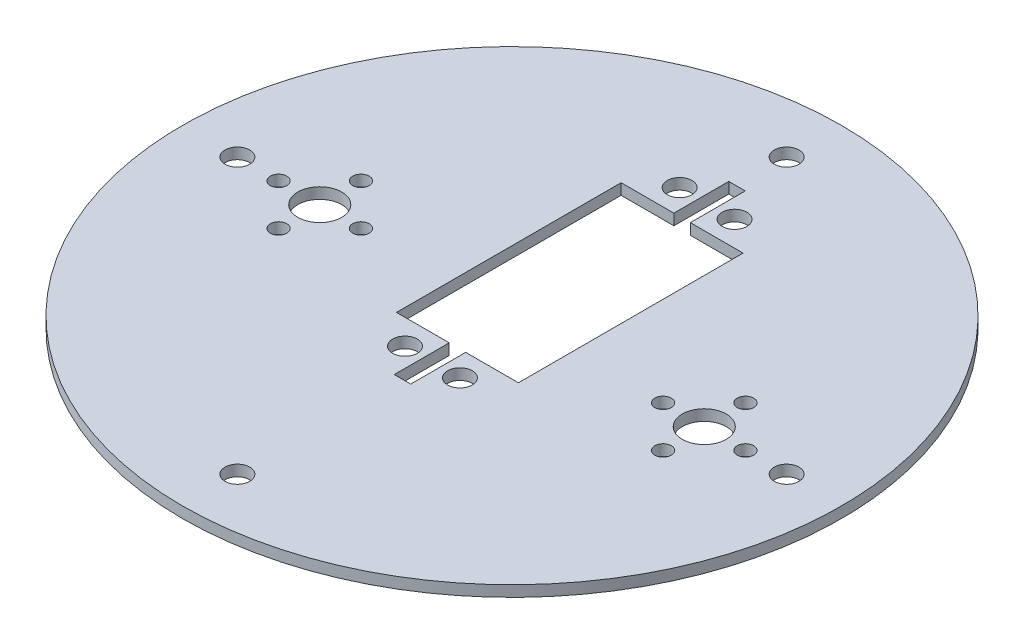
ISO-10303-21;
HEADER;
FILE_DESCRIPTION(('STEP AP214'),'2;1');
FILE_NAME('part.step','',(''),(''),'','','');
FILE_SCHEMA(('AUTOMOTIVE_DESIGN { 1 0 10303 214 1 1 1 1 }'));
ENDSEC;
DATA;
#1=APPLICATION_CONTEXT('core data for automotive mechanical design processes');
#2=APPLICATION_PROTOCOL_DEFINITION('international standard','automotive_design',2000,#1);
#3=PRODUCT_CONTEXT('',#1,'mechanical');
#4=PRODUCT('Part','Part','',(#3));
#5=PRODUCT_RELATED_PRODUCT_CATEGORY('part','',(#4));
#6=PRODUCT_DEFINITION_FORMATION('','',#4);
#7=PRODUCT_DEFINITION_CONTEXT('part definition',#1,'design');
#8=PRODUCT_DEFINITION('design','',#6,#7);
#9=PRODUCT_DEFINITION_SHAPE('','',#8);
#10=(LENGTH_UNIT() NAMED_UNIT(*) SI_UNIT(.MILLI.,.METRE.));
#11=(NAMED_UNIT(*) PLANE_ANGLE_UNIT() SI_UNIT($,.RADIAN.));
#12=(NAMED_UNIT(*) SI_UNIT($,.STERADIAN.) SOLID_ANGLE_UNIT());
#13=UNCERTAINTY_MEASURE_WITH_UNIT(LENGTH_MEASURE(1.E-05),#10,'distance_accuracy_value','');
#14=(GEOMETRIC_REPRESENTATION_CONTEXT(3) GLOBAL_UNCERTAINTY_ASSIGNED_CONTEXT((#13)) GLOBAL_UNIT_ASSIGNED_CONTEXT((#10,
#11,#12)) REPRESENTATION_CONTEXT('',''));
#15=CARTESIAN_POINT('',(0.,0.,0.));
#16=DIRECTION('',(0.,0.,1.));
#17=DIRECTION('',(1.,0.,0.));
#18=AXIS2_PLACEMENT_3D('',#15,#16,#17);
#19=CARTESIAN_POINT('',(0.,2.,-30.9));
#20=DIRECTION('',(0.,0.,-1.));
#21=DIRECTION('',(-1.,0.,0.));
#22=AXIS2_PLACEMENT_3D('',#19,#20,#21);
#23=PLANE('',#22);
#24=DIRECTION('',(0.,-1.,0.));
#25=VECTOR('',#24,1.);
#26=CARTESIAN_POINT('',(1.56757903743948,2.,-30.9));
#27=LINE('',#26,#25);
#28=CARTESIAN_POINT('',(1.56757903743948,2.,-30.9));
#29=VERTEX_POINT('',#28);
#30=CARTESIAN_POINT('',(1.56757903743948,0.,-30.9));
#31=VERTEX_POINT('',#30);
#32=EDGE_CURVE('E156',#29,#31,#27,.T.);
#33=ORIENTED_EDGE('',*,*,#32,.T.);
#34=DIRECTION('',(1.,0.,0.));
#35=VECTOR('',#34,1.);
#36=CARTESIAN_POINT('',(0.,0.,-30.9));
#37=LINE('',#36,#35);
#38=CARTESIAN_POINT('',(11.1675790374395,0.,-30.9));
#39=VERTEX_POINT('',#38);
#40=EDGE_CURVE('E317',#31,#39,#37,.T.);
#41=ORIENTED_EDGE('',*,*,#40,.T.);
#42=DIRECTION('',(0.,-1.,0.));
#43=VECTOR('',#42,1.);
#44=CARTESIAN_POINT('',(11.1675790374395,2.,-30.9));
#45=LINE('',#44,#43);
#46=CARTESIAN_POINT('',(11.1675790374395,2.,-30.9));
#47=VERTEX_POINT('',#46);
#48=EDGE_CURVE('E253',#47,#39,#45,.T.);
#49=ORIENTED_EDGE('',*,*,#48,.F.);
#50=DIRECTION('',(1.,0.,0.));
#51=VECTOR('',#50,1.);
#52=CARTESIAN_POINT('',(0.,2.,-30.9));
#53=LINE('',#52,#51);
#54=EDGE_CURVE('E248',#29,#47,#53,.T.);
#55=ORIENTED_EDGE('',*,*,#54,.F.);
#56=EDGE_LOOP('',(#33,#41,#49,#55));
#57=FACE_BOUND('',#56,.T.);
#58=ADVANCED_FACE('F34',(#57),#23,.F.);
#59=CARTESIAN_POINT('',(0.,2.,10.));
#60=DIRECTION('',(0.,0.,-1.));
#61=DIRECTION('',(-1.,0.,0.));
#62=AXIS2_PLACEMENT_3D('',#59,#60,#61);
#63=PLANE('',#62);
#64=DIRECTION('',(1.,0.,0.));
#65=VECTOR('',#64,1.);
#66=CARTESIAN_POINT('',(0.,2.,10.));
#67=LINE('',#66,#65);
#68=CARTESIAN_POINT('',(-11.0324209625605,2.,10.));
#69=VERTEX_POINT('',#68);
#70=CARTESIAN_POINT('',(-1.43242096256052,2.,10.));
#71=VERTEX_POINT('',#70);
#72=EDGE_CURVE('E243',#69,#71,#67,.T.);
#73=ORIENTED_EDGE('',*,*,#72,.T.);
#74=DIRECTION('',(0.,-1.,0.));
#75=VECTOR('',#74,1.);
#76=CARTESIAN_POINT('',(-1.43242096256052,2.,10.));
#77=LINE('',#76,#75);
#78=CARTESIAN_POINT('',(-1.43242096256052,0.,10.));
#79=VERTEX_POINT('',#78);
#80=EDGE_CURVE('E178',#71,#79,#77,.T.);
#81=ORIENTED_EDGE('',*,*,#80,.T.);
#82=DIRECTION('',(1.,0.,0.));
#83=VECTOR('',#82,1.);
#84=CARTESIAN_POINT('',(0.,0.,10.));
#85=LINE('',#84,#83);
#86=CARTESIAN_POINT('',(-11.0324209625605,0.,10.));
#87=VERTEX_POINT('',#86);
#88=EDGE_CURVE('E311',#87,#79,#85,.T.);
#89=ORIENTED_EDGE('',*,*,#88,.F.);
#90=DIRECTION('',(0.,-1.,0.));
#91=VECTOR('',#90,1.);
#92=CARTESIAN_POINT('',(-11.0324209625605,2.,10.));
#93=LINE('',#92,#91);
#94=EDGE_CURVE('E42',#69,#87,#93,.T.);
#95=ORIENTED_EDGE('',*,*,#94,.F.);
#96=EDGE_LOOP('',(#73,#81,#89,#95));
#97=FACE_BOUND('',#96,.T.);
#98=ADVANCED_FACE('F338',(#97),#63,.T.);
#99=CARTESIAN_POINT('',(11.1675790374395,2.,0.));
#100=DIRECTION('',(-1.,0.,0.));
#101=DIRECTION('',(0.,0.,1.));
#102=AXIS2_PLACEMENT_3D('',#99,#100,#101);
#103=PLANE('',#102);
#104=DIRECTION('',(0.,0.,-1.));
#105=VECTOR('',#104,1.);
#106=CARTESIAN_POINT('',(11.1675790374395,0.,0.));
#107=LINE('',#106,#105);
#108=CARTESIAN_POINT('',(11.1675790374395,0.,10.));
#109=VERTEX_POINT('',#108);
#110=EDGE_CURVE('E307',#109,#39,#107,.T.);
#111=ORIENTED_EDGE('',*,*,#110,.F.);
#112=DIRECTION('',(0.,-1.,0.));
#113=VECTOR('',#112,1.);
#114=CARTESIAN_POINT('',(11.1675790374395,2.,10.));
#115=LINE('',#114,#113);
#116=CARTESIAN_POINT('',(11.1675790374395,2.,10.));
#117=VERTEX_POINT('',#116);
#118=EDGE_CURVE('E11',#117,#109,#115,.T.);
#119=ORIENTED_EDGE('',*,*,#118,.F.);
#120=DIRECTION('',(0.,0.,-1.));
#121=VECTOR('',#120,1.);
#122=CARTESIAN_POINT('',(11.1675790374395,2.,0.));
#123=LINE('',#122,#121);
#124=EDGE_CURVE('E239',#117,#47,#123,.T.);
#125=ORIENTED_EDGE('',*,*,#124,.T.);
#126=ORIENTED_EDGE('',*,*,#48,.T.);
#127=EDGE_LOOP('',(#111,#119,#125,#126));
#128=FACE_BOUND('',#127,.T.);
#129=ADVANCED_FACE('F359',(#128),#103,.T.);
#130=DIRECTION('',(0.,-1.,0.));
#131=VECTOR('',#130,1.);
#132=CARTESIAN_POINT('',(1.56757903743948,2.,10.));
#133=LINE('',#132,#131);
#134=CARTESIAN_POINT('',(1.56757903743948,2.,10.));
#135=VERTEX_POINT('',#134);
#136=CARTESIAN_POINT('',(1.56757903743948,0.,10.));
#137=VERTEX_POINT('',#136);
#138=EDGE_CURVE('E175',#135,#137,#133,.T.);
#139=ORIENTED_EDGE('',*,*,#138,.F.);
#140=EDGE_CURVE('E242',#135,#117,#67,.T.);
#141=ORIENTED_EDGE('',*,*,#140,.T.);
#142=ORIENTED_EDGE('',*,*,#118,.T.);
#143=EDGE_CURVE('E310',#137,#109,#85,.T.);
#144=ORIENTED_EDGE('',*,*,#143,.F.);
#145=EDGE_LOOP('',(#139,#141,#142,#144));
#146=FACE_BOUND('',#145,.T.);
#147=ADVANCED_FACE('F352',(#146),#63,.T.);
#148=CARTESIAN_POINT('',(-11.0324209625605,2.,0.));
#149=DIRECTION('',(-1.,0.,0.));
#150=DIRECTION('',(0.,0.,1.));
#151=AXIS2_PLACEMENT_3D('',#148,#149,#150);
#152=PLANE('',#151);
#153=DIRECTION('',(0.,0.,-1.));
#154=VECTOR('',#153,1.);
#155=CARTESIAN_POINT('',(-11.0324209625605,0.,0.));
#156=LINE('',#155,#154);
#157=CARTESIAN_POINT('',(-11.0324209625605,0.,-30.9));
#158=VERTEX_POINT('',#157);
#159=EDGE_CURVE('E314',#87,#158,#156,.T.);
#160=ORIENTED_EDGE('',*,*,#159,.T.);
#161=DIRECTION('',(0.,-1.,0.));
#162=VECTOR('',#161,1.);
#163=CARTESIAN_POINT('',(-11.0324209625605,2.,-30.9));
#164=LINE('',#163,#162);
#165=CARTESIAN_POINT('',(-11.0324209625605,2.,-30.9));
#166=VERTEX_POINT('',#165);
#167=EDGE_CURVE('E325',#166,#158,#164,.T.);
#168=ORIENTED_EDGE('',*,*,#167,.F.);
#169=DIRECTION('',(0.,0.,-1.));
#170=VECTOR('',#169,1.);
#171=CARTESIAN_POINT('',(-11.0324209625605,2.,0.));
#172=LINE('',#171,#170);
#173=EDGE_CURVE('E246',#69,#166,#172,.T.);
#174=ORIENTED_EDGE('',*,*,#173,.F.);
#175=ORIENTED_EDGE('',*,*,#94,.T.);
#176=EDGE_LOOP('',(#160,#168,#174,#175));
#177=FACE_BOUND('',#176,.T.);
#178=ADVANCED_FACE('F330',(#177),#152,.F.);
#179=CARTESIAN_POINT('',(-1.43242096256052,0.,-30.9));
#180=VERTEX_POINT('',#179);
#181=EDGE_CURVE('E318',#158,#180,#37,.T.);
#182=ORIENTED_EDGE('',*,*,#181,.T.);
#183=DIRECTION('',(0.,-1.,0.));
#184=VECTOR('',#183,1.);
#185=CARTESIAN_POINT('',(-1.43242096256052,2.,-30.9));
#186=LINE('',#185,#184);
#187=CARTESIAN_POINT('',(-1.43242096256052,2.,-30.9));
#188=VERTEX_POINT('',#187);
#189=EDGE_CURVE('E154',#188,#180,#186,.T.);
#190=ORIENTED_EDGE('',*,*,#189,.F.);
#191=EDGE_CURVE('E144',#166,#188,#53,.T.);
#192=ORIENTED_EDGE('',*,*,#191,.F.);
#193=ORIENTED_EDGE('',*,*,#167,.T.);
#194=EDGE_LOOP('',(#182,#190,#192,#193));
#195=FACE_BOUND('',#194,.T.);
#196=ADVANCED_FACE('F365',(#195),#23,.F.);
#197=CARTESIAN_POINT('',(0.,2.,-50.));
#198=DIRECTION('',(0.,-1.,0.));
#199=DIRECTION('',(0.,0.,-1.));
#200=AXIS2_PLACEMENT_3D('',#197,#198,#199);
#201=CYLINDRICAL_SURFACE('',#200,2.25);
#202=CARTESIAN_POINT('',(0.,2.,-50.));
#203=DIRECTION('',(0.,1.,0.));
#204=DIRECTION('',(0.,0.,1.));
#205=AXIS2_PLACEMENT_3D('',#202,#203,#204);
#206=CIRCLE('',#205,2.25);
#207=CARTESIAN_POINT('',(0.,2.,-47.75));
#208=VERTEX_POINT('',#207);
#209=EDGE_CURVE('E236',#208,#208,#206,.T.);
#210=ORIENTED_EDGE('',*,*,#209,.T.);
#211=EDGE_LOOP('',(#210));
#212=FACE_BOUND('',#211,.T.);
#213=CARTESIAN_POINT('',(0.,0.,-50.));
#214=DIRECTION('',(0.,1.,0.));
#215=DIRECTION('',(0.,0.,1.));
#216=AXIS2_PLACEMENT_3D('',#213,#214,#215);
#217=CIRCLE('',#216,2.25);
#218=CARTESIAN_POINT('',(0.,0.,-47.75));
#219=VERTEX_POINT('',#218);
#220=EDGE_CURVE('E304',#219,#219,#217,.T.);
#221=ORIENTED_EDGE('',*,*,#220,.F.);
#222=EDGE_LOOP('',(#221));
#223=FACE_BOUND('',#222,.T.);
#224=ADVANCED_FACE('F367',(#212,#223),#201,.F.);
#225=CARTESIAN_POINT('',(50.,2.,0.));
#226=DIRECTION('',(0.,-1.,0.));
#227=DIRECTION('',(0.,0.,-1.));
#228=AXIS2_PLACEMENT_3D('',#225,#226,#227);
#229=CYLINDRICAL_SURFACE('',#228,2.25000000000017);
#230=CARTESIAN_POINT('',(50.,2.,0.));
#231=DIRECTION('',(0.,1.,0.));
#232=DIRECTION('',(0.,0.,1.));
#233=AXIS2_PLACEMENT_3D('',#230,#231,#232);
#234=CIRCLE('',#233,2.25000000000017);
#235=CARTESIAN_POINT('',(50.,2.,2.25000000000017));
#236=VERTEX_POINT('',#235);
#237=EDGE_CURVE('E233',#236,#236,#234,.T.);
#238=ORIENTED_EDGE('',*,*,#237,.T.);
#239=EDGE_LOOP('',(#238));
#240=FACE_BOUND('',#239,.T.);
#241=CARTESIAN_POINT('',(50.,0.,0.));
#242=DIRECTION('',(0.,1.,0.));
#243=DIRECTION('',(0.,0.,1.));
#244=AXIS2_PLACEMENT_3D('',#241,#242,#243);
#245=CIRCLE('',#244,2.25000000000017);
#246=CARTESIAN_POINT('',(50.,0.,2.25000000000017));
#247=VERTEX_POINT('',#246);
#248=EDGE_CURVE('E301',#247,#247,#245,.T.);
#249=ORIENTED_EDGE('',*,*,#248,.F.);
#250=EDGE_LOOP('',(#249));
#251=FACE_BOUND('',#250,.T.);
#252=ADVANCED_FACE('F373',(#240,#251),#229,.F.);
#253=CARTESIAN_POINT('',(0.,2.,50.));
#254=DIRECTION('',(0.,-1.,0.));
#255=DIRECTION('',(0.,0.,-1.));
#256=AXIS2_PLACEMENT_3D('',#253,#254,#255);
#257=CYLINDRICAL_SURFACE('',#256,2.25000000000035);
#258=CARTESIAN_POINT('',(0.,2.,50.));
#259=DIRECTION('',(0.,1.,0.));
#260=DIRECTION('',(0.,0.,1.));
#261=AXIS2_PLACEMENT_3D('',#258,#259,#260);
#262=CIRCLE('',#261,2.25000000000035);
#263=CARTESIAN_POINT('',(0.,2.,52.2500000000004));
#264=VERTEX_POINT('',#263);
#265=EDGE_CURVE('E230',#264,#264,#262,.T.);
#266=ORIENTED_EDGE('',*,*,#265,.T.);
#267=EDGE_LOOP('',(#266));
#268=FACE_BOUND('',#267,.T.);
#269=CARTESIAN_POINT('',(0.,0.,50.));
#270=DIRECTION('',(0.,1.,0.));
#271=DIRECTION('',(0.,0.,1.));
#272=AXIS2_PLACEMENT_3D('',#269,#270,#271);
#273=CIRCLE('',#272,2.25000000000035);
#274=CARTESIAN_POINT('',(0.,0.,52.2500000000004));
#275=VERTEX_POINT('',#274);
#276=EDGE_CURVE('E298',#275,#275,#273,.T.);
#277=ORIENTED_EDGE('',*,*,#276,.F.);
#278=EDGE_LOOP('',(#277));
#279=FACE_BOUND('',#278,.T.);
#280=ADVANCED_FACE('F415',(#268,#279),#257,.F.);
#281=CARTESIAN_POINT('',(-50.,2.,0.));
#282=DIRECTION('',(0.,-1.,0.));
#283=DIRECTION('',(0.,0.,-1.));
#284=AXIS2_PLACEMENT_3D('',#281,#282,#283);
#285=CYLINDRICAL_SURFACE('',#284,2.25000000000052);
#286=CARTESIAN_POINT('',(-50.,2.,0.));
#287=DIRECTION('',(0.,1.,0.));
#288=DIRECTION('',(0.,0.,1.));
#289=AXIS2_PLACEMENT_3D('',#286,#287,#288);
#290=CIRCLE('',#289,2.25000000000052);
#291=CARTESIAN_POINT('',(-50.,2.,2.25000000000053));
#292=VERTEX_POINT('',#291);
#293=EDGE_CURVE('E227',#292,#292,#290,.T.);
#294=ORIENTED_EDGE('',*,*,#293,.T.);
#295=EDGE_LOOP('',(#294));
#296=FACE_BOUND('',#295,.T.);
#297=CARTESIAN_POINT('',(-50.,0.,0.));
#298=DIRECTION('',(0.,1.,0.));
#299=DIRECTION('',(0.,0.,1.));
#300=AXIS2_PLACEMENT_3D('',#297,#298,#299);
#301=CIRCLE('',#300,2.25000000000052);
#302=CARTESIAN_POINT('',(-50.,0.,2.25000000000053));
#303=VERTEX_POINT('',#302);
#304=EDGE_CURVE('E295',#303,#303,#301,.T.);
#305=ORIENTED_EDGE('',*,*,#304,.F.);
#306=EDGE_LOOP('',(#305));
#307=FACE_BOUND('',#306,.T.);
#308=ADVANCED_FACE('F425',(#296,#307),#285,.F.);
#309=CARTESIAN_POINT('',(-4.93242096256052,2.,-35.45));
#310=DIRECTION('',(0.,-1.,0.));
#311=DIRECTION('',(0.,0.,-1.));
#312=AXIS2_PLACEMENT_3D('',#309,#310,#311);
#313=CYLINDRICAL_SURFACE('',#312,2.25);
#314=CARTESIAN_POINT('',(-4.93242096256052,2.,-35.45));
#315=DIRECTION('',(0.,1.,0.));
#316=DIRECTION('',(0.,0.,1.));
#317=AXIS2_PLACEMENT_3D('',#314,#315,#316);
#318=CIRCLE('',#317,2.25);
#319=CARTESIAN_POINT('',(-4.93242096256052,2.,-33.2));
#320=VERTEX_POINT('',#319);
#321=EDGE_CURVE('E224',#320,#320,#318,.T.);
#322=ORIENTED_EDGE('',*,*,#321,.T.);
#323=EDGE_LOOP('',(#322));
#324=FACE_BOUND('',#323,.T.);
#325=CARTESIAN_POINT('',(-4.93242096256052,0.,-35.45));
#326=DIRECTION('',(0.,1.,0.));
#327=DIRECTION('',(0.,0.,1.));
#328=AXIS2_PLACEMENT_3D('',#325,#326,#327);
#329=CIRCLE('',#328,2.25);
#330=CARTESIAN_POINT('',(-4.93242096256052,0.,-33.2));
#331=VERTEX_POINT('',#330);
#332=EDGE_CURVE('E292',#331,#331,#329,.T.);
#333=ORIENTED_EDGE('',*,*,#332,.F.);
#334=EDGE_LOOP('',(#333));
#335=FACE_BOUND('',#334,.T.);
#336=ADVANCED_FACE('F435',(#324,#335),#313,.F.);
#337=CARTESIAN_POINT('',(5.06757903743948,2.,-35.45));
#338=DIRECTION('',(0.,-1.,0.));
#339=DIRECTION('',(0.,0.,-1.));
#340=AXIS2_PLACEMENT_3D('',#337,#338,#339);
#341=CYLINDRICAL_SURFACE('',#340,2.25);
#342=CARTESIAN_POINT('',(5.06757903743948,2.,-35.45));
#343=DIRECTION('',(0.,1.,0.));
#344=DIRECTION('',(0.,0.,1.));
#345=AXIS2_PLACEMENT_3D('',#342,#343,#344);
#346=CIRCLE('',#345,2.25);
#347=CARTESIAN_POINT('',(5.06757903743948,2.,-33.2));
#348=VERTEX_POINT('',#347);
#349=EDGE_CURVE('E221',#348,#348,#346,.T.);
#350=ORIENTED_EDGE('',*,*,#349,.T.);
#351=EDGE_LOOP('',(#350));
#352=FACE_BOUND('',#351,.T.);
#353=CARTESIAN_POINT('',(5.06757903743948,0.,-35.45));
#354=DIRECTION('',(0.,1.,0.));
#355=DIRECTION('',(0.,0.,1.));
#356=AXIS2_PLACEMENT_3D('',#353,#354,#355);
#357=CIRCLE('',#356,2.25);
#358=CARTESIAN_POINT('',(5.06757903743948,0.,-33.2));
#359=VERTEX_POINT('',#358);
#360=EDGE_CURVE('E289',#359,#359,#357,.T.);
#361=ORIENTED_EDGE('',*,*,#360,.F.);
#362=EDGE_LOOP('',(#361));
#363=FACE_BOUND('',#362,.T.);
#364=ADVANCED_FACE('F445',(#352,#363),#341,.F.);
#365=CARTESIAN_POINT('',(5.06757903744,2.,14.55));
#366=DIRECTION('',(0.,-1.,0.));
#367=DIRECTION('',(0.,0.,-1.));
#368=AXIS2_PLACEMENT_3D('',#365,#366,#367);
#369=CYLINDRICAL_SURFACE('',#368,2.25);
#370=CARTESIAN_POINT('',(5.06757903744,2.,14.55));
#371=DIRECTION('',(0.,1.,0.));
#372=DIRECTION('',(0.,0.,1.));
#373=AXIS2_PLACEMENT_3D('',#370,#371,#372);
#374=CIRCLE('',#373,2.25);
#375=CARTESIAN_POINT('',(5.06757903744,2.,16.8));
#376=VERTEX_POINT('',#375);
#377=EDGE_CURVE('E218',#376,#376,#374,.T.);
#378=ORIENTED_EDGE('',*,*,#377,.T.);
#379=EDGE_LOOP('',(#378));
#380=FACE_BOUND('',#379,.T.);
#381=CARTESIAN_POINT('',(5.06757903744,0.,14.55));
#382=DIRECTION('',(0.,1.,0.));
#383=DIRECTION('',(0.,0.,1.));
#384=AXIS2_PLACEMENT_3D('',#381,#382,#383);
#385=CIRCLE('',#384,2.25);
#386=CARTESIAN_POINT('',(5.06757903744,0.,16.8));
#387=VERTEX_POINT('',#386);
#388=EDGE_CURVE('E286',#387,#387,#385,.T.);
#389=ORIENTED_EDGE('',*,*,#388,.F.);
#390=EDGE_LOOP('',(#389));
#391=FACE_BOUND('',#390,.T.);
#392=ADVANCED_FACE('F455',(#380,#391),#369,.F.);
#393=CARTESIAN_POINT('',(-4.93242096256,2.,14.55));
#394=DIRECTION('',(0.,-1.,0.));
#395=DIRECTION('',(0.,0.,-1.));
#396=AXIS2_PLACEMENT_3D('',#393,#394,#395);
#397=CYLINDRICAL_SURFACE('',#396,2.25);
#398=CARTESIAN_POINT('',(-4.93242096256,2.,14.55));
#399=DIRECTION('',(0.,1.,0.));
#400=DIRECTION('',(0.,0.,1.));
#401=AXIS2_PLACEMENT_3D('',#398,#399,#400);
#402=CIRCLE('',#401,2.25);
#403=CARTESIAN_POINT('',(-4.93242096256,2.,16.8));
#404=VERTEX_POINT('',#403);
#405=EDGE_CURVE('E215',#404,#404,#402,.T.);
#406=ORIENTED_EDGE('',*,*,#405,.T.);
#407=EDGE_LOOP('',(#406));
#408=FACE_BOUND('',#407,.T.);
#409=CARTESIAN_POINT('',(-4.93242096256,0.,14.55));
#410=DIRECTION('',(0.,1.,0.));
#411=DIRECTION('',(0.,0.,1.));
#412=AXIS2_PLACEMENT_3D('',#409,#410,#411);
#413=CIRCLE('',#412,2.25);
#414=CARTESIAN_POINT('',(-4.93242096256,0.,16.8));
#415=VERTEX_POINT('',#414);
#416=EDGE_CURVE('E283',#415,#415,#413,.T.);
#417=ORIENTED_EDGE('',*,*,#416,.F.);
#418=EDGE_LOOP('',(#417));
#419=FACE_BOUND('',#418,.T.);
#420=ADVANCED_FACE('F465',(#408,#419),#397,.F.);
#421=CARTESIAN_POINT('',(-35.,2.,0.));
#422=DIRECTION('',(0.,-1.,0.));
#423=DIRECTION('',(0.,0.,-1.));
#424=AXIS2_PLACEMENT_3D('',#421,#422,#423);
#425=CYLINDRICAL_SURFACE('',#424,4.);
#426=CARTESIAN_POINT('',(-35.,2.,0.));
#427=DIRECTION('',(0.,1.,0.));
#428=DIRECTION('',(0.,0.,1.));
#429=AXIS2_PLACEMENT_3D('',#426,#427,#428);
#430=CIRCLE('',#429,4.);
#431=CARTESIAN_POINT('',(-35.,2.,4.));
#432=VERTEX_POINT('',#431);
#433=EDGE_CURVE('E212',#432,#432,#430,.T.);
#434=ORIENTED_EDGE('',*,*,#433,.T.);
#435=EDGE_LOOP('',(#434));
#436=FACE_BOUND('',#435,.T.);
#437=CARTESIAN_POINT('',(-35.,0.,0.));
#438=DIRECTION('',(0.,1.,0.));
#439=DIRECTION('',(0.,0.,1.));
#440=AXIS2_PLACEMENT_3D('',#437,#438,#439);
#441=CIRCLE('',#440,4.);
#442=CARTESIAN_POINT('',(-35.,0.,4.));
#443=VERTEX_POINT('',#442);
#444=EDGE_CURVE('E280',#443,#443,#441,.T.);
#445=ORIENTED_EDGE('',*,*,#444,.F.);
#446=EDGE_LOOP('',(#445));
#447=FACE_BOUND('',#446,.T.);
#448=ADVANCED_FACE('F475',(#436,#447),#425,.F.);
#449=CARTESIAN_POINT('',(-42.5,2.,0.));
#450=DIRECTION('',(0.,-1.,0.));
#451=DIRECTION('',(0.,0.,-1.));
#452=AXIS2_PLACEMENT_3D('',#449,#450,#451);
#453=CYLINDRICAL_SURFACE('',#452,1.5);
#454=CARTESIAN_POINT('',(-42.5,2.,0.));
#455=DIRECTION('',(0.,1.,0.));
#456=DIRECTION('',(0.,0.,1.));
#457=AXIS2_PLACEMENT_3D('',#454,#455,#456);
#458=CIRCLE('',#457,1.5);
#459=CARTESIAN_POINT('',(-42.5,2.,1.5));
#460=VERTEX_POINT('',#459);
#461=EDGE_CURVE('E209',#460,#460,#458,.T.);
#462=ORIENTED_EDGE('',*,*,#461,.T.);
#463=EDGE_LOOP('',(#462));
#464=FACE_BOUND('',#463,.T.);
#465=CARTESIAN_POINT('',(-42.5,0.,0.));
#466=DIRECTION('',(0.,1.,0.));
#467=DIRECTION('',(0.,0.,1.));
#468=AXIS2_PLACEMENT_3D('',#465,#466,#467);
#469=CIRCLE('',#468,1.5);
#470=CARTESIAN_POINT('',(-42.5,0.,1.5));
#471=VERTEX_POINT('',#470);
#472=EDGE_CURVE('E277',#471,#471,#469,.T.);
#473=ORIENTED_EDGE('',*,*,#472,.F.);
#474=EDGE_LOOP('',(#473));
#475=FACE_BOUND('',#474,.T.);
#476=ADVANCED_FACE('F485',(#464,#475),#453,.F.);
#477=CARTESIAN_POINT('',(-35.,2.,-7.5));
#478=DIRECTION('',(0.,-1.,0.));
#479=DIRECTION('',(0.,0.,-1.));
#480=AXIS2_PLACEMENT_3D('',#477,#478,#479);
#481=CYLINDRICAL_SURFACE('',#480,1.5);
#482=CARTESIAN_POINT('',(-35.,2.,-7.5));
#483=DIRECTION('',(0.,1.,0.));
#484=DIRECTION('',(0.,0.,1.));
#485=AXIS2_PLACEMENT_3D('',#482,#483,#484);
#486=CIRCLE('',#485,1.5);
#487=CARTESIAN_POINT('',(-35.,2.,-6.));
#488=VERTEX_POINT('',#487);
#489=EDGE_CURVE('E206',#488,#488,#486,.T.);
#490=ORIENTED_EDGE('',*,*,#489,.T.);
#491=EDGE_LOOP('',(#490));
#492=FACE_BOUND('',#491,.T.);
#493=CARTESIAN_POINT('',(-35.,0.,-7.5));
#494=DIRECTION('',(0.,1.,0.));
#495=DIRECTION('',(0.,0.,1.));
#496=AXIS2_PLACEMENT_3D('',#493,#494,#495);
#497=CIRCLE('',#496,1.5);
#498=CARTESIAN_POINT('',(-35.,0.,-6.));
#499=VERTEX_POINT('',#498);
#500=EDGE_CURVE('E274',#499,#499,#497,.T.);
#501=ORIENTED_EDGE('',*,*,#500,.F.);
#502=EDGE_LOOP('',(#501));
#503=FACE_BOUND('',#502,.T.);
#504=ADVANCED_FACE('F495',(#492,#503),#481,.F.);
#505=CARTESIAN_POINT('',(-27.5,2.,0.));
#506=DIRECTION('',(0.,-1.,0.));
#507=DIRECTION('',(0.,0.,-1.));
#508=AXIS2_PLACEMENT_3D('',#505,#506,#507);
#509=CYLINDRICAL_SURFACE('',#508,1.5);
#510=CARTESIAN_POINT('',(-27.5,2.,0.));
#511=DIRECTION('',(0.,1.,0.));
#512=DIRECTION('',(0.,0.,1.));
#513=AXIS2_PLACEMENT_3D('',#510,#511,#512);
#514=CIRCLE('',#513,1.5);
#515=CARTESIAN_POINT('',(-27.5,2.,1.50000000000005));
#516=VERTEX_POINT('',#515);
#517=EDGE_CURVE('E203',#516,#516,#514,.T.);
#518=ORIENTED_EDGE('',*,*,#517,.T.);
#519=EDGE_LOOP('',(#518));
#520=FACE_BOUND('',#519,.T.);
#521=CARTESIAN_POINT('',(-27.5,0.,0.));
#522=DIRECTION('',(0.,1.,0.));
#523=DIRECTION('',(0.,0.,1.));
#524=AXIS2_PLACEMENT_3D('',#521,#522,#523);
#525=CIRCLE('',#524,1.5);
#526=CARTESIAN_POINT('',(-27.5,0.,1.50000000000005));
#527=VERTEX_POINT('',#526);
#528=EDGE_CURVE('E271',#527,#527,#525,.T.);
#529=ORIENTED_EDGE('',*,*,#528,.F.);
#530=EDGE_LOOP('',(#529));
#531=FACE_BOUND('',#530,.T.);
#532=ADVANCED_FACE('F505',(#520,#531),#509,.F.);
#533=CARTESIAN_POINT('',(-35.0000000000001,2.,7.5));
#534=DIRECTION('',(0.,-1.,0.));
#535=DIRECTION('',(0.,0.,-1.));
#536=AXIS2_PLACEMENT_3D('',#533,#534,#535);
#537=CYLINDRICAL_SURFACE('',#536,1.50000000000001);
#538=CARTESIAN_POINT('',(-35.0000000000001,2.,7.5));
#539=DIRECTION('',(0.,1.,0.));
#540=DIRECTION('',(0.,0.,1.));
#541=AXIS2_PLACEMENT_3D('',#538,#539,#540);
#542=CIRCLE('',#541,1.50000000000001);
#543=CARTESIAN_POINT('',(-35.0000000000001,2.,9.00000000000001));
#544=VERTEX_POINT('',#543);
#545=EDGE_CURVE('E200',#544,#544,#542,.T.);
#546=ORIENTED_EDGE('',*,*,#545,.T.);
#547=EDGE_LOOP('',(#546));
#548=FACE_BOUND('',#547,.T.);
#549=CARTESIAN_POINT('',(-35.0000000000001,0.,7.5));
#550=DIRECTION('',(0.,1.,0.));
#551=DIRECTION('',(0.,0.,1.));
#552=AXIS2_PLACEMENT_3D('',#549,#550,#551);
#553=CIRCLE('',#552,1.50000000000001);
#554=CARTESIAN_POINT('',(-35.0000000000001,0.,9.00000000000001));
#555=VERTEX_POINT('',#554);
#556=EDGE_CURVE('E268',#555,#555,#553,.T.);
#557=ORIENTED_EDGE('',*,*,#556,.F.);
#558=EDGE_LOOP('',(#557));
#559=FACE_BOUND('',#558,.T.);
#560=ADVANCED_FACE('F515',(#548,#559),#537,.F.);
#561=CARTESIAN_POINT('',(42.5,2.,2.96775913801666E-13));
#562=DIRECTION('',(0.,-1.,0.));
#563=DIRECTION('',(0.,0.,-1.));
#564=AXIS2_PLACEMENT_3D('',#561,#562,#563);
#565=CYLINDRICAL_SURFACE('',#564,1.5);
#566=CARTESIAN_POINT('',(42.5,2.,2.96775913801666E-13));
#567=DIRECTION('',(0.,1.,0.));
#568=DIRECTION('',(0.,0.,1.));
#569=AXIS2_PLACEMENT_3D('',#566,#567,#568);
#570=CIRCLE('',#569,1.5);
#571=CARTESIAN_POINT('',(42.5,2.,1.5000000000003));
#572=VERTEX_POINT('',#571);
#573=EDGE_CURVE('E197',#572,#572,#570,.T.);
#574=ORIENTED_EDGE('',*,*,#573,.T.);
#575=EDGE_LOOP('',(#574));
#576=FACE_BOUND('',#575,.T.);
#577=CARTESIAN_POINT('',(42.5,0.,2.96775913801666E-13));
#578=DIRECTION('',(0.,1.,0.));
#579=DIRECTION('',(0.,0.,1.));
#580=AXIS2_PLACEMENT_3D('',#577,#578,#579);
#581=CIRCLE('',#580,1.5);
#582=CARTESIAN_POINT('',(42.5,0.,1.5000000000003));
#583=VERTEX_POINT('',#582);
#584=EDGE_CURVE('E265',#583,#583,#581,.T.);
#585=ORIENTED_EDGE('',*,*,#584,.F.);
#586=EDGE_LOOP('',(#585));
#587=FACE_BOUND('',#586,.T.);
#588=ADVANCED_FACE('F525',(#576,#587),#565,.F.);
#589=CARTESIAN_POINT('',(35.,2.,2.44403693719019E-13));
#590=DIRECTION('',(0.,-1.,0.));
#591=DIRECTION('',(0.,0.,-1.));
#592=AXIS2_PLACEMENT_3D('',#589,#590,#591);
#593=CYLINDRICAL_SURFACE('',#592,4.);
#594=CARTESIAN_POINT('',(35.,2.,2.44403693719019E-13));
#595=DIRECTION('',(0.,1.,0.));
#596=DIRECTION('',(0.,0.,1.));
#597=AXIS2_PLACEMENT_3D('',#594,#595,#596);
#598=CIRCLE('',#597,4.);
#599=CARTESIAN_POINT('',(35.,2.,4.00000000000024));
#600=VERTEX_POINT('',#599);
#601=EDGE_CURVE('E194',#600,#600,#598,.T.);
#602=ORIENTED_EDGE('',*,*,#601,.T.);
#603=EDGE_LOOP('',(#602));
#604=FACE_BOUND('',#603,.T.);
#605=CARTESIAN_POINT('',(35.,0.,2.44403693719019E-13));
#606=DIRECTION('',(0.,1.,0.));
#607=DIRECTION('',(0.,0.,1.));
#608=AXIS2_PLACEMENT_3D('',#605,#606,#607);
#609=CIRCLE('',#608,4.);
#610=CARTESIAN_POINT('',(35.,0.,4.00000000000024));
#611=VERTEX_POINT('',#610);
#612=EDGE_CURVE('E262',#611,#611,#609,.T.);
#613=ORIENTED_EDGE('',*,*,#612,.F.);
#614=EDGE_LOOP('',(#613));
#615=FACE_BOUND('',#614,.T.);
#616=ADVANCED_FACE('F535',(#604,#615),#593,.F.);
#617=CARTESIAN_POINT('',(34.9999999999999,2.,7.50000000000024));
#618=DIRECTION('',(0.,-1.,0.));
#619=DIRECTION('',(0.,0.,-1.));
#620=AXIS2_PLACEMENT_3D('',#617,#618,#619);
#621=CYLINDRICAL_SURFACE('',#620,1.5);
#622=CARTESIAN_POINT('',(34.9999999999999,2.,7.50000000000024));
#623=DIRECTION('',(0.,1.,0.));
#624=DIRECTION('',(0.,0.,1.));
#625=AXIS2_PLACEMENT_3D('',#622,#623,#624);
#626=CIRCLE('',#625,1.5);
#627=CARTESIAN_POINT('',(34.9999999999999,2.,9.00000000000025));
#628=VERTEX_POINT('',#627);
#629=EDGE_CURVE('E191',#628,#628,#626,.T.);
#630=ORIENTED_EDGE('',*,*,#629,.T.);
#631=EDGE_LOOP('',(#630));
#632=FACE_BOUND('',#631,.T.);
#633=CARTESIAN_POINT('',(34.9999999999999,0.,7.50000000000024));
#634=DIRECTION('',(0.,1.,0.));
#635=DIRECTION('',(0.,0.,1.));
#636=AXIS2_PLACEMENT_3D('',#633,#634,#635);
#637=CIRCLE('',#636,1.5);
#638=CARTESIAN_POINT('',(34.9999999999999,0.,9.00000000000025));
#639=VERTEX_POINT('',#638);
#640=EDGE_CURVE('E259',#639,#639,#637,.T.);
#641=ORIENTED_EDGE('',*,*,#640,.F.);
#642=EDGE_LOOP('',(#641));
#643=FACE_BOUND('',#642,.T.);
#644=ADVANCED_FACE('F545',(#632,#643),#621,.F.);
#645=CARTESIAN_POINT('',(27.5,2.,1.39659253553725E-13));
#646=DIRECTION('',(0.,-1.,0.));
#647=DIRECTION('',(0.,0.,-1.));
#648=AXIS2_PLACEMENT_3D('',#645,#646,#647);
#649=CYLINDRICAL_SURFACE('',#648,1.5);
#650=CARTESIAN_POINT('',(27.5,2.,1.39659253553725E-13));
#651=DIRECTION('',(0.,1.,0.));
#652=DIRECTION('',(0.,0.,1.));
#653=AXIS2_PLACEMENT_3D('',#650,#651,#652);
#654=CIRCLE('',#653,1.5);
#655=CARTESIAN_POINT('',(27.5,2.,1.50000000000014));
#656=VERTEX_POINT('',#655);
#657=EDGE_CURVE('E187',#656,#656,#654,.T.);
#658=ORIENTED_EDGE('',*,*,#657,.T.);
#659=EDGE_LOOP('',(#658));
#660=FACE_BOUND('',#659,.T.);
#661=CARTESIAN_POINT('',(27.5,0.,1.39659253553725E-13));
#662=DIRECTION('',(0.,1.,0.));
#663=DIRECTION('',(0.,0.,1.));
#664=AXIS2_PLACEMENT_3D('',#661,#662,#663);
#665=CIRCLE('',#664,1.5);
#666=CARTESIAN_POINT('',(27.5,0.,1.50000000000014));
#667=VERTEX_POINT('',#666);
#668=EDGE_CURVE('E256',#667,#667,#665,.T.);
#669=ORIENTED_EDGE('',*,*,#668,.F.);
#670=EDGE_LOOP('',(#669));
#671=FACE_BOUND('',#670,.T.);
#672=ADVANCED_FACE('F555',(#660,#671),#649,.F.);
#673=CARTESIAN_POINT('',(35.0000000000001,2.,-7.49999999999975));
#674=DIRECTION('',(0.,-1.,0.));
#675=DIRECTION('',(0.,0.,-1.));
#676=AXIS2_PLACEMENT_3D('',#673,#674,#675);
#677=CYLINDRICAL_SURFACE('',#676,1.50000000000001);
#678=CARTESIAN_POINT('',(35.0000000000001,2.,-7.49999999999975));
#679=DIRECTION('',(0.,1.,0.));
#680=DIRECTION('',(0.,0.,1.));
#681=AXIS2_PLACEMENT_3D('',#678,#679,#680);
#682=CIRCLE('',#681,1.50000000000001);
#683=CARTESIAN_POINT('',(35.0000000000001,2.,-5.99999999999975));
#684=VERTEX_POINT('',#683);
#685=EDGE_CURVE('E184',#684,#684,#682,.T.);
#686=ORIENTED_EDGE('',*,*,#685,.T.);
#687=EDGE_LOOP('',(#686));
#688=FACE_BOUND('',#687,.T.);
#689=CARTESIAN_POINT('',(35.0000000000001,0.,-7.49999999999975));
#690=DIRECTION('',(0.,1.,0.));
#691=DIRECTION('',(0.,0.,1.));
#692=AXIS2_PLACEMENT_3D('',#689,#690,#691);
#693=CIRCLE('',#692,1.50000000000001);
#694=CARTESIAN_POINT('',(35.0000000000001,0.,-5.99999999999975));
#695=VERTEX_POINT('',#694);
#696=EDGE_CURVE('E177',#695,#695,#693,.T.);
#697=ORIENTED_EDGE('',*,*,#696,.F.);
#698=EDGE_LOOP('',(#697));
#699=FACE_BOUND('',#698,.T.);
#700=ADVANCED_FACE('F36',(#688,#699),#677,.F.);
#701=CARTESIAN_POINT('',(0.,2.,0.));
#702=DIRECTION('',(0.,-1.,0.));
#703=DIRECTION('',(0.,0.,-1.));
#704=AXIS2_PLACEMENT_3D('',#701,#702,#703);
#705=CYLINDRICAL_SURFACE('',#704,60.);
#706=CARTESIAN_POINT('',(0.,2.,0.));
#707=DIRECTION('',(0.,1.,0.));
#708=DIRECTION('',(0.,0.,1.));
#709=AXIS2_PLACEMENT_3D('',#706,#707,#708);
#710=CIRCLE('',#709,60.);
#711=CARTESIAN_POINT('',(0.,2.,60.));
#712=VERTEX_POINT('',#711);
#713=EDGE_CURVE('E250',#712,#712,#710,.T.);
#714=ORIENTED_EDGE('',*,*,#713,.F.);
#715=EDGE_LOOP('',(#714));
#716=FACE_BOUND('',#715,.T.);
#717=CARTESIAN_POINT('',(0.,0.,0.));
#718=DIRECTION('',(0.,1.,0.));
#719=DIRECTION('',(0.,0.,1.));
#720=AXIS2_PLACEMENT_3D('',#717,#718,#719);
#721=CIRCLE('',#720,60.);
#722=CARTESIAN_POINT('',(0.,0.,60.));
#723=VERTEX_POINT('',#722);
#724=EDGE_CURVE('E188',#723,#723,#721,.T.);
#725=ORIENTED_EDGE('',*,*,#724,.T.);
#726=EDGE_LOOP('',(#725));
#727=FACE_BOUND('',#726,.T.);
#728=ADVANCED_FACE('F573',(#716,#727),#705,.T.);
#729=CARTESIAN_POINT('',(0.,2.,0.));
#730=DIRECTION('',(0.,1.,0.));
#731=DIRECTION('',(0.,0.,1.));
#732=AXIS2_PLACEMENT_3D('',#729,#730,#731);
#733=PLANE('',#732);
#734=DIRECTION('',(0.,0.,-1.));
#735=VECTOR('',#734,1.);
#736=CARTESIAN_POINT('',(-1.43242096256052,2.,-30.9));
#737=LINE('',#736,#735);
#738=CARTESIAN_POINT('',(-1.43242096256052,2.,-40.9));
#739=VERTEX_POINT('',#738);
#740=EDGE_CURVE('E135',#188,#739,#737,.T.);
#741=ORIENTED_EDGE('',*,*,#740,.T.);
#742=DIRECTION('',(-1.,0.,0.));
#743=VECTOR('',#742,1.);
#744=CARTESIAN_POINT('',(1.56757903743948,2.,-40.9));
#745=LINE('',#744,#743);
#746=CARTESIAN_POINT('',(1.56757903743948,2.,-40.9));
#747=VERTEX_POINT('',#746);
#748=EDGE_CURVE('E125',#747,#739,#745,.T.);
#749=ORIENTED_EDGE('',*,*,#748,.F.);
#750=DIRECTION('',(0.,0.,-1.));
#751=VECTOR('',#750,1.);
#752=CARTESIAN_POINT('',(1.56757903743948,2.,-30.9));
#753=LINE('',#752,#751);
#754=EDGE_CURVE('E134',#29,#747,#753,.T.);
#755=ORIENTED_EDGE('',*,*,#754,.F.);
#756=ORIENTED_EDGE('',*,*,#54,.T.);
#757=ORIENTED_EDGE('',*,*,#124,.F.);
#758=ORIENTED_EDGE('',*,*,#140,.F.);
#759=DIRECTION('',(0.,0.,1.));
#760=VECTOR('',#759,1.);
#761=CARTESIAN_POINT('',(1.56757903743948,2.,10.));
#762=LINE('',#761,#760);
#763=CARTESIAN_POINT('',(1.56757903743948,2.,20.));
#764=VERTEX_POINT('',#763);
#765=EDGE_CURVE('E160',#135,#764,#762,.T.);
#766=ORIENTED_EDGE('',*,*,#765,.T.);
#767=DIRECTION('',(1.,0.,0.));
#768=VECTOR('',#767,1.);
#769=CARTESIAN_POINT('',(-1.43242096256052,2.,20.));
#770=LINE('',#769,#768);
#771=CARTESIAN_POINT('',(-1.43242096256052,2.,20.));
#772=VERTEX_POINT('',#771);
#773=EDGE_CURVE('E163',#772,#764,#770,.T.);
#774=ORIENTED_EDGE('',*,*,#773,.F.);
#775=DIRECTION('',(0.,0.,1.));
#776=VECTOR('',#775,1.);
#777=CARTESIAN_POINT('',(-1.43242096256052,2.,10.));
#778=LINE('',#777,#776);
#779=EDGE_CURVE('E166',#71,#772,#778,.T.);
#780=ORIENTED_EDGE('',*,*,#779,.F.);
#781=ORIENTED_EDGE('',*,*,#72,.F.);
#782=ORIENTED_EDGE('',*,*,#173,.T.);
#783=ORIENTED_EDGE('',*,*,#191,.T.);
#784=EDGE_LOOP('',(#741,#749,#755,#756,#757,#758,#766,#774,#780,#781,#782,#783));
#785=FACE_BOUND('',#784,.T.);
#786=ORIENTED_EDGE('',*,*,#685,.F.);
#787=EDGE_LOOP('',(#786));
#788=FACE_BOUND('',#787,.T.);
#789=ORIENTED_EDGE('',*,*,#657,.F.);
#790=EDGE_LOOP('',(#789));
#791=FACE_BOUND('',#790,.T.);
#792=ORIENTED_EDGE('',*,*,#629,.F.);
#793=EDGE_LOOP('',(#792));
#794=FACE_BOUND('',#793,.T.);
#795=ORIENTED_EDGE('',*,*,#601,.F.);
#796=EDGE_LOOP('',(#795));
#797=FACE_BOUND('',#796,.T.);
#798=ORIENTED_EDGE('',*,*,#573,.F.);
#799=EDGE_LOOP('',(#798));
#800=FACE_BOUND('',#799,.T.);
#801=ORIENTED_EDGE('',*,*,#545,.F.);
#802=EDGE_LOOP('',(#801));
#803=FACE_BOUND('',#802,.T.);
#804=ORIENTED_EDGE('',*,*,#517,.F.);
#805=EDGE_LOOP('',(#804));
#806=FACE_BOUND('',#805,.T.);
#807=ORIENTED_EDGE('',*,*,#489,.F.);
#808=EDGE_LOOP('',(#807));
#809=FACE_BOUND('',#808,.T.);
#810=ORIENTED_EDGE('',*,*,#461,.F.);
#811=EDGE_LOOP('',(#810));
#812=FACE_BOUND('',#811,.T.);
#813=ORIENTED_EDGE('',*,*,#433,.F.);
#814=EDGE_LOOP('',(#813));
#815=FACE_BOUND('',#814,.T.);
#816=ORIENTED_EDGE('',*,*,#405,.F.);
#817=EDGE_LOOP('',(#816));
#818=FACE_BOUND('',#817,.T.);
#819=ORIENTED_EDGE('',*,*,#377,.F.);
#820=EDGE_LOOP('',(#819));
#821=FACE_BOUND('',#820,.T.);
#822=ORIENTED_EDGE('',*,*,#349,.F.);
#823=EDGE_LOOP('',(#822));
#824=FACE_BOUND('',#823,.T.);
#825=ORIENTED_EDGE('',*,*,#321,.F.);
#826=EDGE_LOOP('',(#825));
#827=FACE_BOUND('',#826,.T.);
#828=ORIENTED_EDGE('',*,*,#293,.F.);
#829=EDGE_LOOP('',(#828));
#830=FACE_BOUND('',#829,.T.);
#831=ORIENTED_EDGE('',*,*,#265,.F.);
#832=EDGE_LOOP('',(#831));
#833=FACE_BOUND('',#832,.T.);
#834=ORIENTED_EDGE('',*,*,#237,.F.);
#835=EDGE_LOOP('',(#834));
#836=FACE_BOUND('',#835,.T.);
#837=ORIENTED_EDGE('',*,*,#209,.F.);
#838=EDGE_LOOP('',(#837));
#839=FACE_BOUND('',#838,.T.);
#840=ORIENTED_EDGE('',*,*,#713,.T.);
#841=EDGE_LOOP('',(#840));
#842=FACE_BOUND('',#841,.T.);
#843=ADVANCED_FACE('F141',(#785,#788,#791,#794,#797,#800,#803,#806,#809,#812,#815,#818,#821,
#824,#827,#830,#833,#836,#839,#842),#733,.T.);
#844=CARTESIAN_POINT('',(0.,0.,0.));
#845=DIRECTION('',(0.,1.,0.));
#846=DIRECTION('',(0.,0.,1.));
#847=AXIS2_PLACEMENT_3D('',#844,#845,#846);
#848=PLANE('',#847);
#849=DIRECTION('',(-1.,0.,0.));
#850=VECTOR('',#849,1.);
#851=CARTESIAN_POINT('',(1.56757903743948,0.,-40.9));
#852=LINE('',#851,#850);
#853=CARTESIAN_POINT('',(1.56757903743948,0.,-40.9));
#854=VERTEX_POINT('',#853);
#855=CARTESIAN_POINT('',(-1.43242096256052,0.,-40.9));
#856=VERTEX_POINT('',#855);
#857=EDGE_CURVE('E148',#854,#856,#852,.T.);
#858=ORIENTED_EDGE('',*,*,#857,.T.);
#859=DIRECTION('',(0.,0.,-1.));
#860=VECTOR('',#859,1.);
#861=CARTESIAN_POINT('',(-1.43242096256052,0.,-30.9));
#862=LINE('',#861,#860);
#863=EDGE_CURVE('E49',#180,#856,#862,.T.);
#864=ORIENTED_EDGE('',*,*,#863,.F.);
#865=ORIENTED_EDGE('',*,*,#181,.F.);
#866=ORIENTED_EDGE('',*,*,#159,.F.);
#867=ORIENTED_EDGE('',*,*,#88,.T.);
#868=DIRECTION('',(0.,0.,1.));
#869=VECTOR('',#868,1.);
#870=CARTESIAN_POINT('',(-1.43242096256052,0.,10.));
#871=LINE('',#870,#869);
#872=CARTESIAN_POINT('',(-1.43242096256052,0.,20.));
#873=VERTEX_POINT('',#872);
#874=EDGE_CURVE('E164',#79,#873,#871,.T.);
#875=ORIENTED_EDGE('',*,*,#874,.T.);
#876=DIRECTION('',(1.,0.,0.));
#877=VECTOR('',#876,1.);
#878=CARTESIAN_POINT('',(-1.43242096256052,0.,20.));
#879=LINE('',#878,#877);
#880=CARTESIAN_POINT('',(1.56757903743948,0.,20.));
#881=VERTEX_POINT('',#880);
#882=EDGE_CURVE('E170',#873,#881,#879,.T.);
#883=ORIENTED_EDGE('',*,*,#882,.T.);
#884=DIRECTION('',(0.,0.,1.));
#885=VECTOR('',#884,1.);
#886=CARTESIAN_POINT('',(1.56757903743948,0.,10.));
#887=LINE('',#886,#885);
#888=EDGE_CURVE('E57',#137,#881,#887,.T.);
#889=ORIENTED_EDGE('',*,*,#888,.F.);
#890=ORIENTED_EDGE('',*,*,#143,.T.);
#891=ORIENTED_EDGE('',*,*,#110,.T.);
#892=ORIENTED_EDGE('',*,*,#40,.F.);
#893=DIRECTION('',(0.,0.,-1.));
#894=VECTOR('',#893,1.);
#895=CARTESIAN_POINT('',(1.56757903743948,0.,-30.9));
#896=LINE('',#895,#894);
#897=EDGE_CURVE('E145',#31,#854,#896,.T.);
#898=ORIENTED_EDGE('',*,*,#897,.T.);
#899=EDGE_LOOP('',(#858,#864,#865,#866,#867,#875,#883,#889,#890,#891,#892,#898));
#900=FACE_BOUND('',#899,.T.);
#901=ORIENTED_EDGE('',*,*,#696,.T.);
#902=EDGE_LOOP('',(#901));
#903=FACE_BOUND('',#902,.T.);
#904=ORIENTED_EDGE('',*,*,#668,.T.);
#905=EDGE_LOOP('',(#904));
#906=FACE_BOUND('',#905,.T.);
#907=ORIENTED_EDGE('',*,*,#640,.T.);
#908=EDGE_LOOP('',(#907));
#909=FACE_BOUND('',#908,.T.);
#910=ORIENTED_EDGE('',*,*,#612,.T.);
#911=EDGE_LOOP('',(#910));
#912=FACE_BOUND('',#911,.T.);
#913=ORIENTED_EDGE('',*,*,#584,.T.);
#914=EDGE_LOOP('',(#913));
#915=FACE_BOUND('',#914,.T.);
#916=ORIENTED_EDGE('',*,*,#556,.T.);
#917=EDGE_LOOP('',(#916));
#918=FACE_BOUND('',#917,.T.);
#919=ORIENTED_EDGE('',*,*,#528,.T.);
#920=EDGE_LOOP('',(#919));
#921=FACE_BOUND('',#920,.T.);
#922=ORIENTED_EDGE('',*,*,#500,.T.);
#923=EDGE_LOOP('',(#922));
#924=FACE_BOUND('',#923,.T.);
#925=ORIENTED_EDGE('',*,*,#472,.T.);
#926=EDGE_LOOP('',(#925));
#927=FACE_BOUND('',#926,.T.);
#928=ORIENTED_EDGE('',*,*,#444,.T.);
#929=EDGE_LOOP('',(#928));
#930=FACE_BOUND('',#929,.T.);
#931=ORIENTED_EDGE('',*,*,#416,.T.);
#932=EDGE_LOOP('',(#931));
#933=FACE_BOUND('',#932,.T.);
#934=ORIENTED_EDGE('',*,*,#388,.T.);
#935=EDGE_LOOP('',(#934));
#936=FACE_BOUND('',#935,.T.);
#937=ORIENTED_EDGE('',*,*,#360,.T.);
#938=EDGE_LOOP('',(#937));
#939=FACE_BOUND('',#938,.T.);
#940=ORIENTED_EDGE('',*,*,#332,.T.);
#941=EDGE_LOOP('',(#940));
#942=FACE_BOUND('',#941,.T.);
#943=ORIENTED_EDGE('',*,*,#304,.T.);
#944=EDGE_LOOP('',(#943));
#945=FACE_BOUND('',#944,.T.);
#946=ORIENTED_EDGE('',*,*,#276,.T.);
#947=EDGE_LOOP('',(#946));
#948=FACE_BOUND('',#947,.T.);
#949=ORIENTED_EDGE('',*,*,#248,.T.);
#950=EDGE_LOOP('',(#949));
#951=FACE_BOUND('',#950,.T.);
#952=ORIENTED_EDGE('',*,*,#220,.T.);
#953=EDGE_LOOP('',(#952));
#954=FACE_BOUND('',#953,.T.);
#955=ORIENTED_EDGE('',*,*,#724,.F.);
#956=EDGE_LOOP('',(#955));
#957=FACE_BOUND('',#956,.T.);
#958=ADVANCED_FACE('F336',(#900,#903,#906,#909,#912,#915,#918,#921,#924,#927,#930,#933,#936,
#939,#942,#945,#948,#951,#954,#957),#848,.F.);
#959=CARTESIAN_POINT('',(1.56757903743948,2.,10.));
#960=DIRECTION('',(1.,0.,0.));
#961=DIRECTION('',(0.,0.,-1.));
#962=AXIS2_PLACEMENT_3D('',#959,#960,#961);
#963=PLANE('',#962);
#964=ORIENTED_EDGE('',*,*,#888,.T.);
#965=DIRECTION('',(0.,-1.,0.));
#966=VECTOR('',#965,1.);
#967=CARTESIAN_POINT('',(1.56757903743948,2.,20.));
#968=LINE('',#967,#966);
#969=EDGE_CURVE('E168',#764,#881,#968,.T.);
#970=ORIENTED_EDGE('',*,*,#969,.F.);
#971=ORIENTED_EDGE('',*,*,#765,.F.);
#972=ORIENTED_EDGE('',*,*,#138,.T.);
#973=EDGE_LOOP('',(#964,#970,#971,#972));
#974=FACE_BOUND('',#973,.T.);
#975=ADVANCED_FACE('F348',(#974),#963,.F.);
#976=CARTESIAN_POINT('',(-1.43242096256052,2.,10.));
#977=DIRECTION('',(1.,0.,0.));
#978=DIRECTION('',(0.,0.,-1.));
#979=AXIS2_PLACEMENT_3D('',#976,#977,#978);
#980=PLANE('',#979);
#981=ORIENTED_EDGE('',*,*,#874,.F.);
#982=ORIENTED_EDGE('',*,*,#80,.F.);
#983=ORIENTED_EDGE('',*,*,#779,.T.);
#984=DIRECTION('',(0.,-1.,0.));
#985=VECTOR('',#984,1.);
#986=CARTESIAN_POINT('',(-1.43242096256052,2.,20.));
#987=LINE('',#986,#985);
#988=EDGE_CURVE('E181',#772,#873,#987,.T.);
#989=ORIENTED_EDGE('',*,*,#988,.T.);
#990=EDGE_LOOP('',(#981,#982,#983,#989));
#991=FACE_BOUND('',#990,.T.);
#992=ADVANCED_FACE('F341',(#991),#980,.T.);
#993=CARTESIAN_POINT('',(-1.43242096256052,2.,20.));
#994=DIRECTION('',(0.,0.,-1.));
#995=DIRECTION('',(-1.,0.,0.));
#996=AXIS2_PLACEMENT_3D('',#993,#994,#995);
#997=PLANE('',#996);
#998=ORIENTED_EDGE('',*,*,#882,.F.);
#999=ORIENTED_EDGE('',*,*,#988,.F.);
#1000=ORIENTED_EDGE('',*,*,#773,.T.);
#1001=ORIENTED_EDGE('',*,*,#969,.T.);
#1002=EDGE_LOOP('',(#998,#999,#1000,#1001));
#1003=FACE_BOUND('',#1002,.T.);
#1004=ADVANCED_FACE('F347',(#1003),#997,.T.);
#1005=CARTESIAN_POINT('',(-1.43242096256052,2.,-30.9));
#1006=DIRECTION('',(-1.,0.,0.));
#1007=DIRECTION('',(0.,0.,1.));
#1008=AXIS2_PLACEMENT_3D('',#1005,#1006,#1007);
#1009=PLANE('',#1008);
#1010=ORIENTED_EDGE('',*,*,#863,.T.);
#1011=DIRECTION('',(0.,-1.,0.));
#1012=VECTOR('',#1011,1.);
#1013=CARTESIAN_POINT('',(-1.43242096256052,2.,-40.9));
#1014=LINE('',#1013,#1012);
#1015=EDGE_CURVE('E128',#739,#856,#1014,.T.);
#1016=ORIENTED_EDGE('',*,*,#1015,.F.);
#1017=ORIENTED_EDGE('',*,*,#740,.F.);
#1018=ORIENTED_EDGE('',*,*,#189,.T.);
#1019=EDGE_LOOP('',(#1010,#1016,#1017,#1018));
#1020=FACE_BOUND('',#1019,.T.);
#1021=ADVANCED_FACE('F137',(#1020),#1009,.F.);
#1022=CARTESIAN_POINT('',(1.56757903743948,2.,-30.9));
#1023=DIRECTION('',(-1.,0.,0.));
#1024=DIRECTION('',(0.,0.,1.));
#1025=AXIS2_PLACEMENT_3D('',#1022,#1023,#1024);
#1026=PLANE('',#1025);
#1027=ORIENTED_EDGE('',*,*,#897,.F.);
#1028=ORIENTED_EDGE('',*,*,#32,.F.);
#1029=ORIENTED_EDGE('',*,*,#754,.T.);
#1030=DIRECTION('',(0.,-1.,0.));
#1031=VECTOR('',#1030,1.);
#1032=CARTESIAN_POINT('',(1.56757903743948,2.,-40.9));
#1033=LINE('',#1032,#1031);
#1034=EDGE_CURVE('E130',#747,#854,#1033,.T.);
#1035=ORIENTED_EDGE('',*,*,#1034,.T.);
#1036=EDGE_LOOP('',(#1027,#1028,#1029,#1035));
#1037=FACE_BOUND('',#1036,.T.);
#1038=ADVANCED_FACE('F363',(#1037),#1026,.T.);
#1039=CARTESIAN_POINT('',(1.56757903743948,2.,-40.9));
#1040=DIRECTION('',(0.,0.,1.));
#1041=DIRECTION('',(1.,0.,0.));
#1042=AXIS2_PLACEMENT_3D('',#1039,#1040,#1041);
#1043=PLANE('',#1042);
#1044=ORIENTED_EDGE('',*,*,#857,.F.);
#1045=ORIENTED_EDGE('',*,*,#1034,.F.);
#1046=ORIENTED_EDGE('',*,*,#748,.T.);
#1047=ORIENTED_EDGE('',*,*,#1015,.T.);
#1048=EDGE_LOOP('',(#1044,#1045,#1046,#1047));
#1049=FACE_BOUND('',#1048,.T.);
#1050=ADVANCED_FACE('F127',(#1049),#1043,.T.);
#1051=CLOSED_SHELL('',(#58,#98,#129,#147,#178,#196,#224,#252,#280,#308,#336,#364,#392,#420,#448,
#476,#504,#532,#560,#588,#616,#644,#672,#700,#728,#843,#958,#975,#992,#1004,#1021,#1038,#1050));
#1052=MANIFOLD_SOLID_BREP('B2',#1051);
#1053=ADVANCED_BREP_SHAPE_REPRESENTATION('',(#18,#1052),#14);
#1054=SHAPE_DEFINITION_REPRESENTATION(#9,#1053);
ENDSEC;
END-ISO-10303-21;
